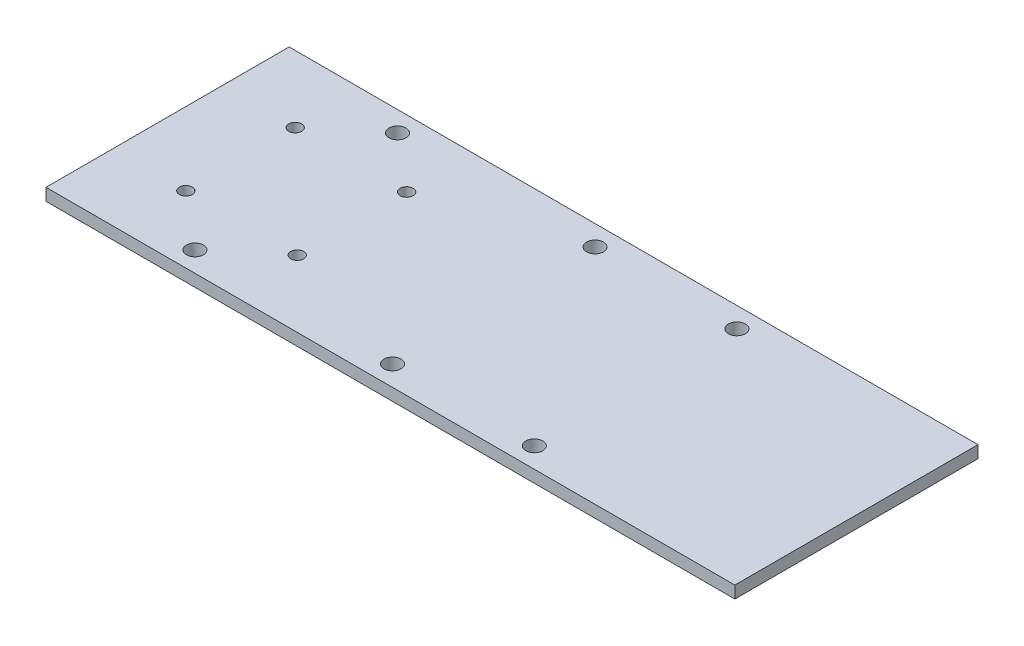
ISO-10303-21;
HEADER;
FILE_DESCRIPTION(('STEP AP214'),'2;1');
FILE_NAME('part.step','',(''),(''),'','','');
FILE_SCHEMA(('AUTOMOTIVE_DESIGN { 1 0 10303 214 1 1 1 1 }'));
ENDSEC;
DATA;
#1=APPLICATION_CONTEXT('core data for automotive mechanical design processes');
#2=APPLICATION_PROTOCOL_DEFINITION('international standard','automotive_design',2000,#1);
#3=PRODUCT_CONTEXT('',#1,'mechanical');
#4=PRODUCT('Part','Part','',(#3));
#5=PRODUCT_RELATED_PRODUCT_CATEGORY('part','',(#4));
#6=PRODUCT_DEFINITION_FORMATION('','',#4);
#7=PRODUCT_DEFINITION_CONTEXT('part definition',#1,'design');
#8=PRODUCT_DEFINITION('design','',#6,#7);
#9=PRODUCT_DEFINITION_SHAPE('','',#8);
#10=(LENGTH_UNIT() NAMED_UNIT(*) SI_UNIT(.MILLI.,.METRE.));
#11=(NAMED_UNIT(*) PLANE_ANGLE_UNIT() SI_UNIT($,.RADIAN.));
#12=(NAMED_UNIT(*) SI_UNIT($,.STERADIAN.) SOLID_ANGLE_UNIT());
#13=UNCERTAINTY_MEASURE_WITH_UNIT(LENGTH_MEASURE(1.E-05),#10,'distance_accuracy_value','');
#14=(GEOMETRIC_REPRESENTATION_CONTEXT(3) GLOBAL_UNCERTAINTY_ASSIGNED_CONTEXT((#13)) GLOBAL_UNIT_ASSIGNED_CONTEXT((#10,
#11,#12)) REPRESENTATION_CONTEXT('',''));
#15=CARTESIAN_POINT('',(0.,0.,0.));
#16=DIRECTION('',(0.,0.,1.));
#17=DIRECTION('',(1.,0.,0.));
#18=AXIS2_PLACEMENT_3D('',#15,#16,#17);
#19=CARTESIAN_POINT('',(-76.4413642857911,3.,0.));
#20=DIRECTION('',(1.,0.,0.));
#21=DIRECTION('',(0.,0.,-1.));
#22=AXIS2_PLACEMENT_3D('',#19,#20,#21);
#23=PLANE('',#22);
#24=DIRECTION('',(0.,0.,1.));
#25=VECTOR('',#24,1.);
#26=CARTESIAN_POINT('',(-76.4413642857911,0.,0.));
#27=LINE('',#26,#25);
#28=CARTESIAN_POINT('',(-76.4413642857912,0.,-102.5));
#29=VERTEX_POINT('',#28);
#30=CARTESIAN_POINT('',(-76.4413642857912,0.,-42.5));
#31=VERTEX_POINT('',#30);
#32=EDGE_CURVE('E98',#29,#31,#27,.T.);
#33=ORIENTED_EDGE('',*,*,#32,.F.);
#34=DIRECTION('',(0.,-1.,0.));
#35=VECTOR('',#34,1.);
#36=CARTESIAN_POINT('',(-76.4413642857912,3.,-102.5));
#37=LINE('',#36,#35);
#38=CARTESIAN_POINT('',(-76.4413642857912,3.,-102.5));
#39=VERTEX_POINT('',#38);
#40=EDGE_CURVE('E11',#39,#29,#37,.T.);
#41=ORIENTED_EDGE('',*,*,#40,.F.);
#42=DIRECTION('',(0.,0.,1.));
#43=VECTOR('',#42,1.);
#44=CARTESIAN_POINT('',(-76.4413642857911,3.,0.));
#45=LINE('',#44,#43);
#46=CARTESIAN_POINT('',(-76.4413642857912,3.,-42.5));
#47=VERTEX_POINT('',#46);
#48=EDGE_CURVE('E91',#39,#47,#45,.T.);
#49=ORIENTED_EDGE('',*,*,#48,.T.);
#50=DIRECTION('',(0.,-1.,0.));
#51=VECTOR('',#50,1.);
#52=CARTESIAN_POINT('',(-76.4413642857912,3.,-42.5));
#53=LINE('',#52,#51);
#54=EDGE_CURVE('E73',#47,#31,#53,.T.);
#55=ORIENTED_EDGE('',*,*,#54,.T.);
#56=EDGE_LOOP('',(#33,#41,#49,#55));
#57=FACE_BOUND('',#56,.T.);
#58=ADVANCED_FACE('F35',(#57),#23,.T.);
#59=CARTESIAN_POINT('',(0.,3.,-102.5));
#60=DIRECTION('',(0.,0.,-1.));
#61=DIRECTION('',(-1.,0.,0.));
#62=AXIS2_PLACEMENT_3D('',#59,#60,#61);
#63=PLANE('',#62);
#64=DIRECTION('',(1.,0.,0.));
#65=VECTOR('',#64,1.);
#66=CARTESIAN_POINT('',(0.,0.,-102.5));
#67=LINE('',#66,#65);
#68=CARTESIAN_POINT('',(-246.441364285791,0.,-102.5));
#69=VERTEX_POINT('',#68);
#70=EDGE_CURVE('E84',#69,#29,#67,.T.);
#71=ORIENTED_EDGE('',*,*,#70,.F.);
#72=DIRECTION('',(0.,-1.,0.));
#73=VECTOR('',#72,1.);
#74=CARTESIAN_POINT('',(-246.441364285791,3.,-102.5));
#75=LINE('',#74,#73);
#76=CARTESIAN_POINT('',(-246.441364285791,3.,-102.5));
#77=VERTEX_POINT('',#76);
#78=EDGE_CURVE('E43',#77,#69,#75,.T.);
#79=ORIENTED_EDGE('',*,*,#78,.F.);
#80=DIRECTION('',(1.,0.,0.));
#81=VECTOR('',#80,1.);
#82=CARTESIAN_POINT('',(0.,3.,-102.5));
#83=LINE('',#82,#81);
#84=EDGE_CURVE('E82',#77,#39,#83,.T.);
#85=ORIENTED_EDGE('',*,*,#84,.T.);
#86=ORIENTED_EDGE('',*,*,#40,.T.);
#87=EDGE_LOOP('',(#71,#79,#85,#86));
#88=FACE_BOUND('',#87,.T.);
#89=ADVANCED_FACE('F81',(#88),#63,.T.);
#90=CARTESIAN_POINT('',(-246.441364285791,3.,0.));
#91=DIRECTION('',(-1.,0.,0.));
#92=DIRECTION('',(0.,0.,1.));
#93=AXIS2_PLACEMENT_3D('',#90,#91,#92);
#94=PLANE('',#93);
#95=DIRECTION('',(0.,0.,-1.));
#96=VECTOR('',#95,1.);
#97=CARTESIAN_POINT('',(-246.441364285791,0.,0.));
#98=LINE('',#97,#96);
#99=CARTESIAN_POINT('',(-246.441364285791,0.,-42.5));
#100=VERTEX_POINT('',#99);
#101=EDGE_CURVE('E103',#100,#69,#98,.T.);
#102=ORIENTED_EDGE('',*,*,#101,.F.);
#103=DIRECTION('',(0.,-1.,0.));
#104=VECTOR('',#103,1.);
#105=CARTESIAN_POINT('',(-246.441364285791,3.,-42.5));
#106=LINE('',#105,#104);
#107=CARTESIAN_POINT('',(-246.441364285791,3.,-42.5));
#108=VERTEX_POINT('',#107);
#109=EDGE_CURVE('E66',#108,#100,#106,.T.);
#110=ORIENTED_EDGE('',*,*,#109,.F.);
#111=DIRECTION('',(0.,0.,-1.));
#112=VECTOR('',#111,1.);
#113=CARTESIAN_POINT('',(-246.441364285791,3.,0.));
#114=LINE('',#113,#112);
#115=EDGE_CURVE('E90',#108,#77,#114,.T.);
#116=ORIENTED_EDGE('',*,*,#115,.T.);
#117=ORIENTED_EDGE('',*,*,#78,.T.);
#118=EDGE_LOOP('',(#102,#110,#116,#117));
#119=FACE_BOUND('',#118,.T.);
#120=ADVANCED_FACE('F93',(#119),#94,.T.);
#121=CARTESIAN_POINT('',(0.,3.,-42.5));
#122=DIRECTION('',(0.,0.,-1.));
#123=DIRECTION('',(-1.,0.,0.));
#124=AXIS2_PLACEMENT_3D('',#121,#122,#123);
#125=PLANE('',#124);
#126=DIRECTION('',(1.,0.,0.));
#127=VECTOR('',#126,1.);
#128=CARTESIAN_POINT('',(0.,0.,-42.5));
#129=LINE('',#128,#127);
#130=EDGE_CURVE('E105',#100,#31,#129,.T.);
#131=ORIENTED_EDGE('',*,*,#130,.T.);
#132=ORIENTED_EDGE('',*,*,#54,.F.);
#133=DIRECTION('',(1.,0.,0.));
#134=VECTOR('',#133,1.);
#135=CARTESIAN_POINT('',(0.,3.,-42.5));
#136=LINE('',#135,#134);
#137=EDGE_CURVE('E51',#108,#47,#136,.T.);
#138=ORIENTED_EDGE('',*,*,#137,.F.);
#139=ORIENTED_EDGE('',*,*,#109,.T.);
#140=EDGE_LOOP('',(#131,#132,#138,#139));
#141=FACE_BOUND('',#140,.T.);
#142=ADVANCED_FACE('F182',(#141),#125,.F.);
#143=CARTESIAN_POINT('',(0.,3.,0.));
#144=DIRECTION('',(0.,1.,0.));
#145=DIRECTION('',(0.,0.,1.));
#146=AXIS2_PLACEMENT_3D('',#143,#144,#145);
#147=PLANE('',#146);
#148=CARTESIAN_POINT('',(-130.941364285791,3.,-47.5));
#149=DIRECTION('',(0.,1.,0.));
#150=DIRECTION('',(0.,0.,-1.));
#151=AXIS2_PLACEMENT_3D('',#148,#149,#150);
#152=CIRCLE('',#151,2.09999999999999);
#153=CARTESIAN_POINT('',(-130.941364285791,3.,-49.6));
#154=VERTEX_POINT('',#153);
#155=EDGE_CURVE('E146',#154,#154,#152,.T.);
#156=ORIENTED_EDGE('',*,*,#155,.F.);
#157=EDGE_LOOP('',(#156));
#158=FACE_BOUND('',#157,.T.);
#159=CARTESIAN_POINT('',(-165.941364285791,3.,-97.4999999999998));
#160=DIRECTION('',(0.,1.,0.));
#161=DIRECTION('',(0.,0.,1.));
#162=AXIS2_PLACEMENT_3D('',#159,#160,#161);
#163=CIRCLE('',#162,2.10000000000002);
#164=CARTESIAN_POINT('',(-165.941364285791,3.,-95.3999999999997));
#165=VERTEX_POINT('',#164);
#166=EDGE_CURVE('E139',#165,#165,#163,.T.);
#167=ORIENTED_EDGE('',*,*,#166,.F.);
#168=EDGE_LOOP('',(#167));
#169=FACE_BOUND('',#168,.T.);
#170=CARTESIAN_POINT('',(-214.691364285791,3.,-97.4999999999998));
#171=DIRECTION('',(0.,1.,0.));
#172=DIRECTION('',(0.,0.,1.));
#173=AXIS2_PLACEMENT_3D('',#170,#171,#172);
#174=CIRCLE('',#173,2.09999999999999);
#175=CARTESIAN_POINT('',(-214.691364285791,3.,-95.3999999999998));
#176=VERTEX_POINT('',#175);
#177=EDGE_CURVE('E163',#176,#176,#174,.T.);
#178=ORIENTED_EDGE('',*,*,#177,.F.);
#179=EDGE_LOOP('',(#178));
#180=FACE_BOUND('',#179,.T.);
#181=CARTESIAN_POINT('',(-165.941364285791,3.,-47.5000000000002));
#182=DIRECTION('',(0.,1.,0.));
#183=DIRECTION('',(0.,0.,-1.));
#184=AXIS2_PLACEMENT_3D('',#181,#182,#183);
#185=CIRCLE('',#184,2.10000000000002);
#186=CARTESIAN_POINT('',(-165.941364285791,3.,-49.6000000000003));
#187=VERTEX_POINT('',#186);
#188=EDGE_CURVE('E157',#187,#187,#185,.T.);
#189=ORIENTED_EDGE('',*,*,#188,.F.);
#190=EDGE_LOOP('',(#189));
#191=FACE_BOUND('',#190,.T.);
#192=CARTESIAN_POINT('',(-214.691364285791,3.,-47.5000000000002));
#193=DIRECTION('',(0.,1.,0.));
#194=DIRECTION('',(0.,0.,-1.));
#195=AXIS2_PLACEMENT_3D('',#192,#193,#194);
#196=CIRCLE('',#195,2.09999999999999);
#197=CARTESIAN_POINT('',(-214.691364285791,3.,-49.6000000000002));
#198=VERTEX_POINT('',#197);
#199=EDGE_CURVE('E151',#198,#198,#196,.T.);
#200=ORIENTED_EDGE('',*,*,#199,.F.);
#201=EDGE_LOOP('',(#200));
#202=FACE_BOUND('',#201,.T.);
#203=CARTESIAN_POINT('',(-228.441364285791,3.,-59.));
#204=DIRECTION('',(0.,1.,0.));
#205=DIRECTION('',(0.,0.,1.));
#206=AXIS2_PLACEMENT_3D('',#203,#204,#205);
#207=CIRCLE('',#206,1.59999999999999);
#208=CARTESIAN_POINT('',(-228.441364285791,3.,-57.4));
#209=VERTEX_POINT('',#208);
#210=EDGE_CURVE('E122',#209,#209,#207,.T.);
#211=ORIENTED_EDGE('',*,*,#210,.F.);
#212=EDGE_LOOP('',(#211));
#213=FACE_BOUND('',#212,.T.);
#214=CARTESIAN_POINT('',(-200.941364285791,3.,-86.));
#215=DIRECTION('',(0.,1.,0.));
#216=DIRECTION('',(0.,0.,1.));
#217=AXIS2_PLACEMENT_3D('',#214,#215,#216);
#218=CIRCLE('',#217,1.59999999999999);
#219=CARTESIAN_POINT('',(-200.941364285791,3.,-84.4));
#220=VERTEX_POINT('',#219);
#221=EDGE_CURVE('E115',#220,#220,#218,.T.);
#222=ORIENTED_EDGE('',*,*,#221,.F.);
#223=EDGE_LOOP('',(#222));
#224=FACE_BOUND('',#223,.T.);
#225=CARTESIAN_POINT('',(-200.941364285791,3.,-59.));
#226=DIRECTION('',(0.,1.,0.));
#227=DIRECTION('',(0.,0.,-1.));
#228=AXIS2_PLACEMENT_3D('',#225,#226,#227);
#229=CIRCLE('',#228,1.59999999999999);
#230=CARTESIAN_POINT('',(-200.941364285791,3.,-60.6));
#231=VERTEX_POINT('',#230);
#232=EDGE_CURVE('E134',#231,#231,#229,.T.);
#233=ORIENTED_EDGE('',*,*,#232,.F.);
#234=EDGE_LOOP('',(#233));
#235=FACE_BOUND('',#234,.T.);
#236=CARTESIAN_POINT('',(-130.941364285791,3.,-97.5));
#237=DIRECTION('',(0.,1.,0.));
#238=DIRECTION('',(0.,0.,1.));
#239=AXIS2_PLACEMENT_3D('',#236,#237,#238);
#240=CIRCLE('',#239,2.10000000000002);
#241=CARTESIAN_POINT('',(-130.941364285791,3.,-95.4));
#242=VERTEX_POINT('',#241);
#243=EDGE_CURVE('E127',#242,#242,#240,.T.);
#244=ORIENTED_EDGE('',*,*,#243,.F.);
#245=EDGE_LOOP('',(#244));
#246=FACE_BOUND('',#245,.T.);
#247=CARTESIAN_POINT('',(-228.441364285791,3.,-86.));
#248=DIRECTION('',(0.,1.,0.));
#249=DIRECTION('',(0.,0.,1.));
#250=AXIS2_PLACEMENT_3D('',#247,#248,#249);
#251=CIRCLE('',#250,1.59999999999999);
#252=CARTESIAN_POINT('',(-228.441364285791,3.,-84.4));
#253=VERTEX_POINT('',#252);
#254=EDGE_CURVE('E109',#253,#253,#251,.T.);
#255=ORIENTED_EDGE('',*,*,#254,.F.);
#256=EDGE_LOOP('',(#255));
#257=FACE_BOUND('',#256,.T.);
#258=ORIENTED_EDGE('',*,*,#48,.F.);
#259=ORIENTED_EDGE('',*,*,#84,.F.);
#260=ORIENTED_EDGE('',*,*,#115,.F.);
#261=ORIENTED_EDGE('',*,*,#137,.T.);
#262=EDGE_LOOP('',(#258,#259,#260,#261));
#263=FACE_BOUND('',#262,.T.);
#264=ADVANCED_FACE('F89',(#158,#169,#180,#191,#202,#213,#224,#235,#246,#257,#263),#147,.T.);
#265=CARTESIAN_POINT('',(0.,0.,0.));
#266=DIRECTION('',(0.,1.,0.));
#267=DIRECTION('',(0.,0.,1.));
#268=AXIS2_PLACEMENT_3D('',#265,#266,#267);
#269=PLANE('',#268);
#270=CARTESIAN_POINT('',(-130.941364285791,0.,-47.5));
#271=DIRECTION('',(0.,1.,0.));
#272=DIRECTION('',(0.,0.,-1.));
#273=AXIS2_PLACEMENT_3D('',#270,#271,#272);
#274=CIRCLE('',#273,2.09999999999999);
#275=CARTESIAN_POINT('',(-130.941364285791,0.,-49.6));
#276=VERTEX_POINT('',#275);
#277=EDGE_CURVE('E131',#276,#276,#274,.T.);
#278=ORIENTED_EDGE('',*,*,#277,.T.);
#279=EDGE_LOOP('',(#278));
#280=FACE_BOUND('',#279,.T.);
#281=CARTESIAN_POINT('',(-165.941364285791,0.,-97.4999999999998));
#282=DIRECTION('',(0.,1.,0.));
#283=DIRECTION('',(0.,0.,1.));
#284=AXIS2_PLACEMENT_3D('',#281,#282,#283);
#285=CIRCLE('',#284,2.10000000000002);
#286=CARTESIAN_POINT('',(-165.941364285791,0.,-95.3999999999997));
#287=VERTEX_POINT('',#286);
#288=EDGE_CURVE('E142',#287,#287,#285,.T.);
#289=ORIENTED_EDGE('',*,*,#288,.T.);
#290=EDGE_LOOP('',(#289));
#291=FACE_BOUND('',#290,.T.);
#292=CARTESIAN_POINT('',(-214.691364285791,0.,-97.4999999999998));
#293=DIRECTION('',(0.,1.,0.));
#294=DIRECTION('',(0.,0.,1.));
#295=AXIS2_PLACEMENT_3D('',#292,#293,#294);
#296=CIRCLE('',#295,2.09999999999999);
#297=CARTESIAN_POINT('',(-214.691364285791,0.,-95.3999999999998));
#298=VERTEX_POINT('',#297);
#299=EDGE_CURVE('E143',#298,#298,#296,.T.);
#300=ORIENTED_EDGE('',*,*,#299,.T.);
#301=EDGE_LOOP('',(#300));
#302=FACE_BOUND('',#301,.T.);
#303=CARTESIAN_POINT('',(-165.941364285791,0.,-47.5000000000002));
#304=DIRECTION('',(0.,1.,0.));
#305=DIRECTION('',(0.,0.,-1.));
#306=AXIS2_PLACEMENT_3D('',#303,#304,#305);
#307=CIRCLE('',#306,2.10000000000002);
#308=CARTESIAN_POINT('',(-165.941364285791,0.,-49.6000000000003));
#309=VERTEX_POINT('',#308);
#310=EDGE_CURVE('E160',#309,#309,#307,.T.);
#311=ORIENTED_EDGE('',*,*,#310,.T.);
#312=EDGE_LOOP('',(#311));
#313=FACE_BOUND('',#312,.T.);
#314=CARTESIAN_POINT('',(-214.691364285791,0.,-47.5000000000002));
#315=DIRECTION('',(0.,1.,0.));
#316=DIRECTION('',(0.,0.,-1.));
#317=AXIS2_PLACEMENT_3D('',#314,#315,#316);
#318=CIRCLE('',#317,2.09999999999999);
#319=CARTESIAN_POINT('',(-214.691364285791,0.,-49.6000000000002));
#320=VERTEX_POINT('',#319);
#321=EDGE_CURVE('E154',#320,#320,#318,.T.);
#322=ORIENTED_EDGE('',*,*,#321,.T.);
#323=EDGE_LOOP('',(#322));
#324=FACE_BOUND('',#323,.T.);
#325=CARTESIAN_POINT('',(-228.441364285791,0.,-59.));
#326=DIRECTION('',(0.,1.,0.));
#327=DIRECTION('',(0.,0.,1.));
#328=AXIS2_PLACEMENT_3D('',#325,#326,#327);
#329=CIRCLE('',#328,1.59999999999999);
#330=CARTESIAN_POINT('',(-228.441364285791,0.,-57.4));
#331=VERTEX_POINT('',#330);
#332=EDGE_CURVE('E112',#331,#331,#329,.T.);
#333=ORIENTED_EDGE('',*,*,#332,.T.);
#334=EDGE_LOOP('',(#333));
#335=FACE_BOUND('',#334,.T.);
#336=CARTESIAN_POINT('',(-200.941364285791,0.,-86.));
#337=DIRECTION('',(0.,1.,0.));
#338=DIRECTION('',(0.,0.,1.));
#339=AXIS2_PLACEMENT_3D('',#336,#337,#338);
#340=CIRCLE('',#339,1.59999999999999);
#341=CARTESIAN_POINT('',(-200.941364285791,0.,-84.4));
#342=VERTEX_POINT('',#341);
#343=EDGE_CURVE('E118',#342,#342,#340,.T.);
#344=ORIENTED_EDGE('',*,*,#343,.T.);
#345=EDGE_LOOP('',(#344));
#346=FACE_BOUND('',#345,.T.);
#347=CARTESIAN_POINT('',(-200.941364285791,0.,-59.));
#348=DIRECTION('',(0.,1.,0.));
#349=DIRECTION('',(0.,0.,-1.));
#350=AXIS2_PLACEMENT_3D('',#347,#348,#349);
#351=CIRCLE('',#350,1.59999999999999);
#352=CARTESIAN_POINT('',(-200.941364285791,0.,-60.6));
#353=VERTEX_POINT('',#352);
#354=EDGE_CURVE('E119',#353,#353,#351,.T.);
#355=ORIENTED_EDGE('',*,*,#354,.T.);
#356=EDGE_LOOP('',(#355));
#357=FACE_BOUND('',#356,.T.);
#358=CARTESIAN_POINT('',(-130.941364285791,0.,-97.5));
#359=DIRECTION('',(0.,1.,0.));
#360=DIRECTION('',(0.,0.,1.));
#361=AXIS2_PLACEMENT_3D('',#358,#359,#360);
#362=CIRCLE('',#361,2.10000000000002);
#363=CARTESIAN_POINT('',(-130.941364285791,0.,-95.4));
#364=VERTEX_POINT('',#363);
#365=EDGE_CURVE('E130',#364,#364,#362,.T.);
#366=ORIENTED_EDGE('',*,*,#365,.T.);
#367=EDGE_LOOP('',(#366));
#368=FACE_BOUND('',#367,.T.);
#369=CARTESIAN_POINT('',(-228.441364285791,0.,-86.));
#370=DIRECTION('',(0.,1.,0.));
#371=DIRECTION('',(0.,0.,1.));
#372=AXIS2_PLACEMENT_3D('',#369,#370,#371);
#373=CIRCLE('',#372,1.59999999999999);
#374=CARTESIAN_POINT('',(-228.441364285791,0.,-84.4));
#375=VERTEX_POINT('',#374);
#376=EDGE_CURVE('E101',#375,#375,#373,.T.);
#377=ORIENTED_EDGE('',*,*,#376,.T.);
#378=EDGE_LOOP('',(#377));
#379=FACE_BOUND('',#378,.T.);
#380=ORIENTED_EDGE('',*,*,#32,.T.);
#381=ORIENTED_EDGE('',*,*,#130,.F.);
#382=ORIENTED_EDGE('',*,*,#101,.T.);
#383=ORIENTED_EDGE('',*,*,#70,.T.);
#384=EDGE_LOOP('',(#380,#381,#382,#383));
#385=FACE_BOUND('',#384,.T.);
#386=ADVANCED_FACE('F169',(#280,#291,#302,#313,#324,#335,#346,#357,#368,#379,#385),#269,.F.);
#387=CARTESIAN_POINT('',(-228.441364285791,0.,-86.));
#388=DIRECTION('',(0.,1.,0.));
#389=DIRECTION('',(0.,0.,1.));
#390=AXIS2_PLACEMENT_3D('',#387,#388,#389);
#391=CYLINDRICAL_SURFACE('',#390,1.59999999999999);
#392=ORIENTED_EDGE('',*,*,#376,.F.);
#393=EDGE_LOOP('',(#392));
#394=FACE_BOUND('',#393,.T.);
#395=ORIENTED_EDGE('',*,*,#254,.T.);
#396=EDGE_LOOP('',(#395));
#397=FACE_BOUND('',#396,.T.);
#398=ADVANCED_FACE('F199',(#394,#397),#391,.F.);
#399=CARTESIAN_POINT('',(-130.941364285791,0.,-97.5));
#400=DIRECTION('',(0.,1.,0.));
#401=DIRECTION('',(0.,0.,1.));
#402=AXIS2_PLACEMENT_3D('',#399,#400,#401);
#403=CYLINDRICAL_SURFACE('',#402,2.10000000000002);
#404=ORIENTED_EDGE('',*,*,#365,.F.);
#405=EDGE_LOOP('',(#404));
#406=FACE_BOUND('',#405,.T.);
#407=ORIENTED_EDGE('',*,*,#243,.T.);
#408=EDGE_LOOP('',(#407));
#409=FACE_BOUND('',#408,.T.);
#410=ADVANCED_FACE('F201',(#406,#409),#403,.F.);
#411=CARTESIAN_POINT('',(-200.941364285791,0.,-59.));
#412=DIRECTION('',(0.,1.,0.));
#413=DIRECTION('',(0.,0.,1.));
#414=AXIS2_PLACEMENT_3D('',#411,#412,#413);
#415=CYLINDRICAL_SURFACE('',#414,1.59999999999999);
#416=ORIENTED_EDGE('',*,*,#354,.F.);
#417=EDGE_LOOP('',(#416));
#418=FACE_BOUND('',#417,.T.);
#419=ORIENTED_EDGE('',*,*,#232,.T.);
#420=EDGE_LOOP('',(#419));
#421=FACE_BOUND('',#420,.T.);
#422=ADVANCED_FACE('F208',(#418,#421),#415,.F.);
#423=CARTESIAN_POINT('',(-200.941364285791,0.,-86.));
#424=DIRECTION('',(0.,1.,0.));
#425=DIRECTION('',(0.,0.,1.));
#426=AXIS2_PLACEMENT_3D('',#423,#424,#425);
#427=CYLINDRICAL_SURFACE('',#426,1.59999999999999);
#428=ORIENTED_EDGE('',*,*,#343,.F.);
#429=EDGE_LOOP('',(#428));
#430=FACE_BOUND('',#429,.T.);
#431=ORIENTED_EDGE('',*,*,#221,.T.);
#432=EDGE_LOOP('',(#431));
#433=FACE_BOUND('',#432,.T.);
#434=ADVANCED_FACE('F257',(#430,#433),#427,.F.);
#435=CARTESIAN_POINT('',(-228.441364285791,0.,-59.));
#436=DIRECTION('',(0.,1.,0.));
#437=DIRECTION('',(0.,0.,1.));
#438=AXIS2_PLACEMENT_3D('',#435,#436,#437);
#439=CYLINDRICAL_SURFACE('',#438,1.59999999999999);
#440=ORIENTED_EDGE('',*,*,#332,.F.);
#441=EDGE_LOOP('',(#440));
#442=FACE_BOUND('',#441,.T.);
#443=ORIENTED_EDGE('',*,*,#210,.T.);
#444=EDGE_LOOP('',(#443));
#445=FACE_BOUND('',#444,.T.);
#446=ADVANCED_FACE('F267',(#442,#445),#439,.F.);
#447=CARTESIAN_POINT('',(-214.691364285791,0.,-47.5000000000002));
#448=DIRECTION('',(0.,1.,0.));
#449=DIRECTION('',(0.,0.,1.));
#450=AXIS2_PLACEMENT_3D('',#447,#448,#449);
#451=CYLINDRICAL_SURFACE('',#450,2.09999999999999);
#452=ORIENTED_EDGE('',*,*,#321,.F.);
#453=EDGE_LOOP('',(#452));
#454=FACE_BOUND('',#453,.T.);
#455=ORIENTED_EDGE('',*,*,#199,.T.);
#456=EDGE_LOOP('',(#455));
#457=FACE_BOUND('',#456,.T.);
#458=ADVANCED_FACE('F276',(#454,#457),#451,.F.);
#459=CARTESIAN_POINT('',(-165.941364285791,0.,-47.5000000000002));
#460=DIRECTION('',(0.,1.,0.));
#461=DIRECTION('',(0.,0.,1.));
#462=AXIS2_PLACEMENT_3D('',#459,#460,#461);
#463=CYLINDRICAL_SURFACE('',#462,2.10000000000002);
#464=ORIENTED_EDGE('',*,*,#310,.F.);
#465=EDGE_LOOP('',(#464));
#466=FACE_BOUND('',#465,.T.);
#467=ORIENTED_EDGE('',*,*,#188,.T.);
#468=EDGE_LOOP('',(#467));
#469=FACE_BOUND('',#468,.T.);
#470=ADVANCED_FACE('F176',(#466,#469),#463,.F.);
#471=CARTESIAN_POINT('',(-214.691364285791,0.,-97.4999999999998));
#472=DIRECTION('',(0.,1.,0.));
#473=DIRECTION('',(0.,0.,1.));
#474=AXIS2_PLACEMENT_3D('',#471,#472,#473);
#475=CYLINDRICAL_SURFACE('',#474,2.09999999999999);
#476=ORIENTED_EDGE('',*,*,#299,.F.);
#477=EDGE_LOOP('',(#476));
#478=FACE_BOUND('',#477,.T.);
#479=ORIENTED_EDGE('',*,*,#177,.T.);
#480=EDGE_LOOP('',(#479));
#481=FACE_BOUND('',#480,.T.);
#482=ADVANCED_FACE('F172',(#478,#481),#475,.F.);
#483=CARTESIAN_POINT('',(-165.941364285791,0.,-97.4999999999998));
#484=DIRECTION('',(0.,1.,0.));
#485=DIRECTION('',(0.,0.,1.));
#486=AXIS2_PLACEMENT_3D('',#483,#484,#485);
#487=CYLINDRICAL_SURFACE('',#486,2.10000000000002);
#488=ORIENTED_EDGE('',*,*,#288,.F.);
#489=EDGE_LOOP('',(#488));
#490=FACE_BOUND('',#489,.T.);
#491=ORIENTED_EDGE('',*,*,#166,.T.);
#492=EDGE_LOOP('',(#491));
#493=FACE_BOUND('',#492,.T.);
#494=ADVANCED_FACE('F175',(#490,#493),#487,.F.);
#495=CARTESIAN_POINT('',(-130.941364285791,0.,-47.5));
#496=DIRECTION('',(0.,1.,0.));
#497=DIRECTION('',(0.,0.,1.));
#498=AXIS2_PLACEMENT_3D('',#495,#496,#497);
#499=CYLINDRICAL_SURFACE('',#498,2.09999999999999);
#500=ORIENTED_EDGE('',*,*,#277,.F.);
#501=EDGE_LOOP('',(#500));
#502=FACE_BOUND('',#501,.T.);
#503=ORIENTED_EDGE('',*,*,#155,.T.);
#504=EDGE_LOOP('',(#503));
#505=FACE_BOUND('',#504,.T.);
#506=ADVANCED_FACE('F310',(#502,#505),#499,.F.);
#507=CLOSED_SHELL('',(#58,#89,#120,#142,#264,#386,#398,#410,#422,#434,#446,#458,#470,#482,#494,#506));
#508=MANIFOLD_SOLID_BREP('B2',#507);
#509=ADVANCED_BREP_SHAPE_REPRESENTATION('',(#18,#508),#14);
#510=SHAPE_DEFINITION_REPRESENTATION(#9,#509);
ENDSEC;
END-ISO-10303-21;
